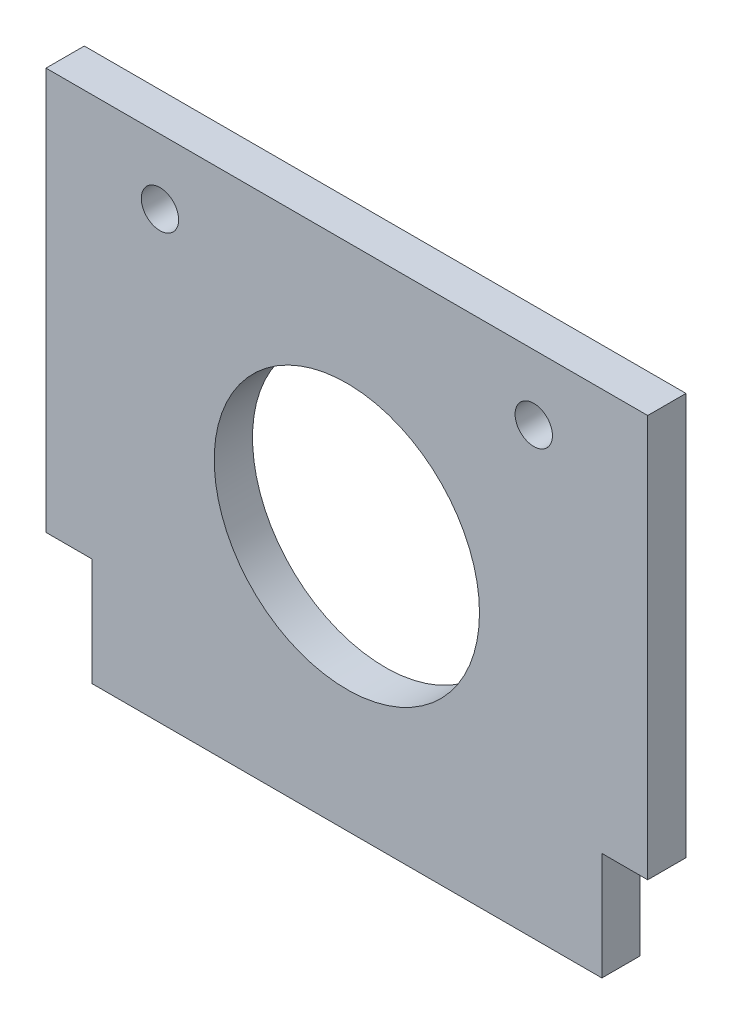
ISO-10303-21;
HEADER;
FILE_DESCRIPTION(('STEP AP214'),'2;1');
FILE_NAME('part.step','',(''),(''),'','','');
FILE_SCHEMA(('AUTOMOTIVE_DESIGN { 1 0 10303 214 1 1 1 1 }'));
ENDSEC;
DATA;
#1=APPLICATION_CONTEXT('core data for automotive mechanical design processes');
#2=APPLICATION_PROTOCOL_DEFINITION('international standard','automotive_design',2000,#1);
#3=PRODUCT_CONTEXT('',#1,'mechanical');
#4=PRODUCT('Part','Part','',(#3));
#5=PRODUCT_RELATED_PRODUCT_CATEGORY('part','',(#4));
#6=PRODUCT_DEFINITION_FORMATION('','',#4);
#7=PRODUCT_DEFINITION_CONTEXT('part definition',#1,'design');
#8=PRODUCT_DEFINITION('design','',#6,#7);
#9=PRODUCT_DEFINITION_SHAPE('','',#8);
#10=(LENGTH_UNIT() NAMED_UNIT(*) SI_UNIT(.MILLI.,.METRE.));
#11=(NAMED_UNIT(*) PLANE_ANGLE_UNIT() SI_UNIT($,.RADIAN.));
#12=(NAMED_UNIT(*) SI_UNIT($,.STERADIAN.) SOLID_ANGLE_UNIT());
#13=UNCERTAINTY_MEASURE_WITH_UNIT(LENGTH_MEASURE(1.E-05),#10,'distance_accuracy_value','');
#14=(GEOMETRIC_REPRESENTATION_CONTEXT(3) GLOBAL_UNCERTAINTY_ASSIGNED_CONTEXT((#13)) GLOBAL_UNIT_ASSIGNED_CONTEXT((#10,
#11,#12)) REPRESENTATION_CONTEXT('',''));
#15=CARTESIAN_POINT('',(0.,0.,0.));
#16=DIRECTION('',(0.,0.,1.));
#17=DIRECTION('',(1.,0.,0.));
#18=AXIS2_PLACEMENT_3D('',#15,#16,#17);
#19=CARTESIAN_POINT('',(0.,0.,3.175));
#20=DIRECTION('',(0.,0.,1.));
#21=DIRECTION('',(1.,0.,0.));
#22=AXIS2_PLACEMENT_3D('',#19,#20,#21);
#23=PLANE('',#22);
#24=CARTESIAN_POINT('',(36.65,36.9,3.175));
#25=DIRECTION('',(0.,0.,1.));
#26=DIRECTION('',(1.,0.,0.));
#27=AXIS2_PLACEMENT_3D('',#24,#25,#26);
#28=CIRCLE('',#27,1.55);
#29=CARTESIAN_POINT('',(38.2,36.9,3.175));
#30=VERTEX_POINT('',#29);
#31=EDGE_CURVE('E192',#30,#30,#28,.T.);
#32=ORIENTED_EDGE('',*,*,#31,.F.);
#33=EDGE_LOOP('',(#32));
#34=FACE_BOUND('',#33,.T.);
#35=DIRECTION('',(0.,-1.,0.));
#36=VECTOR('',#35,1.);
#37=CARTESIAN_POINT('',(0.,0.,3.175));
#38=LINE('',#37,#36);
#39=CARTESIAN_POINT('',(0.,8.95010245944664,3.175));
#40=VERTEX_POINT('',#39);
#41=CARTESIAN_POINT('',(0.,0.,3.175));
#42=VERTEX_POINT('',#41);
#43=EDGE_CURVE('E155',#40,#42,#38,.T.);
#44=ORIENTED_EDGE('',*,*,#43,.T.);
#45=DIRECTION('',(1.,0.,0.));
#46=VECTOR('',#45,1.);
#47=CARTESIAN_POINT('',(0.,0.,3.175));
#48=LINE('',#47,#46);
#49=CARTESIAN_POINT('',(42.3,0.,3.175));
#50=VERTEX_POINT('',#49);
#51=EDGE_CURVE('E103',#42,#50,#48,.T.);
#52=ORIENTED_EDGE('',*,*,#51,.T.);
#53=DIRECTION('',(0.,1.,0.));
#54=VECTOR('',#53,1.);
#55=CARTESIAN_POINT('',(42.3,0.,3.175));
#56=LINE('',#55,#54);
#57=CARTESIAN_POINT('',(42.3,8.95010245944664,3.175));
#58=VERTEX_POINT('',#57);
#59=EDGE_CURVE('E170',#50,#58,#56,.T.);
#60=ORIENTED_EDGE('',*,*,#59,.T.);
#61=DIRECTION('',(1.,0.,0.));
#62=VECTOR('',#61,1.);
#63=CARTESIAN_POINT('',(42.3,8.95010245944664,3.175));
#64=LINE('',#63,#62);
#65=CARTESIAN_POINT('',(46.1,8.95010245944664,3.175));
#66=VERTEX_POINT('',#65);
#67=EDGE_CURVE('E183',#58,#66,#64,.T.);
#68=ORIENTED_EDGE('',*,*,#67,.T.);
#69=DIRECTION('',(0.,1.,0.));
#70=VECTOR('',#69,1.);
#71=CARTESIAN_POINT('',(46.1,42.3,3.175));
#72=LINE('',#71,#70);
#73=CARTESIAN_POINT('',(46.1,42.3,3.175));
#74=VERTEX_POINT('',#73);
#75=EDGE_CURVE('E122',#66,#74,#72,.T.);
#76=ORIENTED_EDGE('',*,*,#75,.T.);
#77=DIRECTION('',(-1.,0.,0.));
#78=VECTOR('',#77,1.);
#79=CARTESIAN_POINT('',(42.3,42.3,3.175));
#80=LINE('',#79,#78);
#81=CARTESIAN_POINT('',(-3.8,42.3,3.175));
#82=VERTEX_POINT('',#81);
#83=EDGE_CURVE('E116',#74,#82,#80,.T.);
#84=ORIENTED_EDGE('',*,*,#83,.T.);
#85=DIRECTION('',(0.,-1.,0.));
#86=VECTOR('',#85,1.);
#87=CARTESIAN_POINT('',(-3.8,42.3,3.175));
#88=LINE('',#87,#86);
#89=CARTESIAN_POINT('',(-3.8,8.95010245944664,3.175));
#90=VERTEX_POINT('',#89);
#91=EDGE_CURVE('E120',#82,#90,#88,.T.);
#92=ORIENTED_EDGE('',*,*,#91,.T.);
#93=DIRECTION('',(1.,0.,0.));
#94=VECTOR('',#93,1.);
#95=CARTESIAN_POINT('',(0.,8.95010245944664,3.175));
#96=LINE('',#95,#94);
#97=EDGE_CURVE('E60',#90,#40,#96,.T.);
#98=ORIENTED_EDGE('',*,*,#97,.T.);
#99=EDGE_LOOP('',(#44,#52,#60,#68,#76,#84,#92,#98));
#100=FACE_BOUND('',#99,.T.);
#101=CARTESIAN_POINT('',(21.15,21.15,3.175));
#102=DIRECTION('',(0.,0.,1.));
#103=DIRECTION('',(1.,0.,0.));
#104=AXIS2_PLACEMENT_3D('',#101,#102,#103);
#105=CIRCLE('',#104,11.);
#106=CARTESIAN_POINT('',(32.15,21.15,3.175));
#107=VERTEX_POINT('',#106);
#108=EDGE_CURVE('E143',#107,#107,#105,.T.);
#109=ORIENTED_EDGE('',*,*,#108,.F.);
#110=EDGE_LOOP('',(#109));
#111=FACE_BOUND('',#110,.T.);
#112=CARTESIAN_POINT('',(5.65,36.9,3.175));
#113=DIRECTION('',(0.,0.,1.));
#114=DIRECTION('',(1.,0.,0.));
#115=AXIS2_PLACEMENT_3D('',#112,#113,#114);
#116=CIRCLE('',#115,1.55);
#117=CARTESIAN_POINT('',(7.2,36.9,3.175));
#118=VERTEX_POINT('',#117);
#119=EDGE_CURVE('E198',#118,#118,#116,.T.);
#120=ORIENTED_EDGE('',*,*,#119,.F.);
#121=EDGE_LOOP('',(#120));
#122=FACE_BOUND('',#121,.T.);
#123=ADVANCED_FACE('F43',(#34,#100,#111,#122),#23,.T.);
#124=CARTESIAN_POINT('',(0.,0.,0.));
#125=DIRECTION('',(0.,0.,1.));
#126=DIRECTION('',(1.,0.,0.));
#127=AXIS2_PLACEMENT_3D('',#124,#125,#126);
#128=PLANE('',#127);
#129=DIRECTION('',(0.,-1.,0.));
#130=VECTOR('',#129,1.);
#131=CARTESIAN_POINT('',(0.,0.,0.));
#132=LINE('',#131,#130);
#133=CARTESIAN_POINT('',(0.,8.95010245944664,0.));
#134=VERTEX_POINT('',#133);
#135=CARTESIAN_POINT('',(0.,0.,0.));
#136=VERTEX_POINT('',#135);
#137=EDGE_CURVE('E139',#134,#136,#132,.T.);
#138=ORIENTED_EDGE('',*,*,#137,.F.);
#139=DIRECTION('',(1.,0.,0.));
#140=VECTOR('',#139,1.);
#141=CARTESIAN_POINT('',(0.,8.95010245944664,0.));
#142=LINE('',#141,#140);
#143=CARTESIAN_POINT('',(-3.8,8.95010245944664,0.));
#144=VERTEX_POINT('',#143);
#145=EDGE_CURVE('E95',#144,#134,#142,.T.);
#146=ORIENTED_EDGE('',*,*,#145,.F.);
#147=DIRECTION('',(0.,-1.,0.));
#148=VECTOR('',#147,1.);
#149=CARTESIAN_POINT('',(-3.8,42.3,0.));
#150=LINE('',#149,#148);
#151=CARTESIAN_POINT('',(-3.8,42.3,0.));
#152=VERTEX_POINT('',#151);
#153=EDGE_CURVE('E89',#152,#144,#150,.T.);
#154=ORIENTED_EDGE('',*,*,#153,.F.);
#155=DIRECTION('',(-1.,0.,0.));
#156=VECTOR('',#155,1.);
#157=CARTESIAN_POINT('',(0.,42.3,0.));
#158=LINE('',#157,#156);
#159=CARTESIAN_POINT('',(46.1,42.3,0.));
#160=VERTEX_POINT('',#159);
#161=EDGE_CURVE('E129',#160,#152,#158,.T.);
#162=ORIENTED_EDGE('',*,*,#161,.F.);
#163=DIRECTION('',(0.,1.,0.));
#164=VECTOR('',#163,1.);
#165=CARTESIAN_POINT('',(46.1,42.3,0.));
#166=LINE('',#165,#164);
#167=CARTESIAN_POINT('',(46.1,8.95010245944664,0.));
#168=VERTEX_POINT('',#167);
#169=EDGE_CURVE('E149',#168,#160,#166,.T.);
#170=ORIENTED_EDGE('',*,*,#169,.F.);
#171=DIRECTION('',(1.,0.,0.));
#172=VECTOR('',#171,1.);
#173=CARTESIAN_POINT('',(42.3,8.95010245944664,0.));
#174=LINE('',#173,#172);
#175=CARTESIAN_POINT('',(42.3,8.95010245944664,0.));
#176=VERTEX_POINT('',#175);
#177=EDGE_CURVE('E147',#176,#168,#174,.T.);
#178=ORIENTED_EDGE('',*,*,#177,.F.);
#179=DIRECTION('',(0.,1.,0.));
#180=VECTOR('',#179,1.);
#181=CARTESIAN_POINT('',(42.3,0.,0.));
#182=LINE('',#181,#180);
#183=CARTESIAN_POINT('',(42.3,0.,0.));
#184=VERTEX_POINT('',#183);
#185=EDGE_CURVE('E145',#184,#176,#182,.T.);
#186=ORIENTED_EDGE('',*,*,#185,.F.);
#187=DIRECTION('',(1.,0.,0.));
#188=VECTOR('',#187,1.);
#189=CARTESIAN_POINT('',(0.,0.,0.));
#190=LINE('',#189,#188);
#191=EDGE_CURVE('E142',#136,#184,#190,.T.);
#192=ORIENTED_EDGE('',*,*,#191,.F.);
#193=EDGE_LOOP('',(#138,#146,#154,#162,#170,#178,#186,#192));
#194=FACE_BOUND('',#193,.T.);
#195=CARTESIAN_POINT('',(21.15,21.15,0.));
#196=DIRECTION('',(0.,0.,1.));
#197=DIRECTION('',(1.,0.,0.));
#198=AXIS2_PLACEMENT_3D('',#195,#196,#197);
#199=CIRCLE('',#198,11.);
#200=CARTESIAN_POINT('',(32.15,21.15,0.));
#201=VERTEX_POINT('',#200);
#202=EDGE_CURVE('E189',#201,#201,#199,.T.);
#203=ORIENTED_EDGE('',*,*,#202,.T.);
#204=EDGE_LOOP('',(#203));
#205=FACE_BOUND('',#204,.T.);
#206=CARTESIAN_POINT('',(36.65,36.9,0.));
#207=DIRECTION('',(0.,0.,1.));
#208=DIRECTION('',(1.,0.,0.));
#209=AXIS2_PLACEMENT_3D('',#206,#207,#208);
#210=CIRCLE('',#209,1.55);
#211=CARTESIAN_POINT('',(38.2,36.9,0.));
#212=VERTEX_POINT('',#211);
#213=EDGE_CURVE('E195',#212,#212,#210,.T.);
#214=ORIENTED_EDGE('',*,*,#213,.T.);
#215=EDGE_LOOP('',(#214));
#216=FACE_BOUND('',#215,.T.);
#217=CARTESIAN_POINT('',(5.65,36.9,0.));
#218=DIRECTION('',(0.,0.,1.));
#219=DIRECTION('',(1.,0.,0.));
#220=AXIS2_PLACEMENT_3D('',#217,#218,#219);
#221=CIRCLE('',#220,1.55);
#222=CARTESIAN_POINT('',(7.2,36.9,0.));
#223=VERTEX_POINT('',#222);
#224=EDGE_CURVE('E201',#223,#223,#221,.T.);
#225=ORIENTED_EDGE('',*,*,#224,.T.);
#226=EDGE_LOOP('',(#225));
#227=FACE_BOUND('',#226,.T.);
#228=ADVANCED_FACE('F174',(#194,#205,#216,#227),#128,.F.);
#229=CARTESIAN_POINT('',(0.,0.,3.175));
#230=DIRECTION('',(1.,0.,0.));
#231=DIRECTION('',(0.,0.,-1.));
#232=AXIS2_PLACEMENT_3D('',#229,#230,#231);
#233=PLANE('',#232);
#234=ORIENTED_EDGE('',*,*,#137,.T.);
#235=DIRECTION('',(0.,0.,-1.));
#236=VECTOR('',#235,1.);
#237=CARTESIAN_POINT('',(0.,0.,3.175));
#238=LINE('',#237,#236);
#239=EDGE_CURVE('E13',#42,#136,#238,.T.);
#240=ORIENTED_EDGE('',*,*,#239,.F.);
#241=ORIENTED_EDGE('',*,*,#43,.F.);
#242=DIRECTION('',(0.,0.,-1.));
#243=VECTOR('',#242,1.);
#244=CARTESIAN_POINT('',(0.,8.95010245944664,3.175));
#245=LINE('',#244,#243);
#246=EDGE_CURVE('E135',#40,#134,#245,.T.);
#247=ORIENTED_EDGE('',*,*,#246,.T.);
#248=EDGE_LOOP('',(#234,#240,#241,#247));
#249=FACE_BOUND('',#248,.T.);
#250=ADVANCED_FACE('F45',(#249),#233,.F.);
#251=CARTESIAN_POINT('',(0.,0.,3.175));
#252=DIRECTION('',(0.,1.,0.));
#253=DIRECTION('',(0.,0.,1.));
#254=AXIS2_PLACEMENT_3D('',#251,#252,#253);
#255=PLANE('',#254);
#256=ORIENTED_EDGE('',*,*,#191,.T.);
#257=DIRECTION('',(0.,0.,-1.));
#258=VECTOR('',#257,1.);
#259=CARTESIAN_POINT('',(42.3,0.,3.175));
#260=LINE('',#259,#258);
#261=EDGE_CURVE('E52',#50,#184,#260,.T.);
#262=ORIENTED_EDGE('',*,*,#261,.F.);
#263=ORIENTED_EDGE('',*,*,#51,.F.);
#264=ORIENTED_EDGE('',*,*,#239,.T.);
#265=EDGE_LOOP('',(#256,#262,#263,#264));
#266=FACE_BOUND('',#265,.T.);
#267=ADVANCED_FACE('F234',(#266),#255,.F.);
#268=CARTESIAN_POINT('',(42.3,0.,3.175));
#269=DIRECTION('',(-1.,0.,0.));
#270=DIRECTION('',(0.,0.,1.));
#271=AXIS2_PLACEMENT_3D('',#268,#269,#270);
#272=PLANE('',#271);
#273=ORIENTED_EDGE('',*,*,#185,.T.);
#274=DIRECTION('',(0.,0.,-1.));
#275=VECTOR('',#274,1.);
#276=CARTESIAN_POINT('',(42.3,8.95010245944664,3.175));
#277=LINE('',#276,#275);
#278=EDGE_CURVE('E162',#58,#176,#277,.T.);
#279=ORIENTED_EDGE('',*,*,#278,.F.);
#280=ORIENTED_EDGE('',*,*,#59,.F.);
#281=ORIENTED_EDGE('',*,*,#261,.T.);
#282=EDGE_LOOP('',(#273,#279,#280,#281));
#283=FACE_BOUND('',#282,.T.);
#284=ADVANCED_FACE('F168',(#283),#272,.F.);
#285=CARTESIAN_POINT('',(42.3,8.95010245944664,3.175));
#286=DIRECTION('',(0.,1.,0.));
#287=DIRECTION('',(0.,0.,1.));
#288=AXIS2_PLACEMENT_3D('',#285,#286,#287);
#289=PLANE('',#288);
#290=ORIENTED_EDGE('',*,*,#177,.T.);
#291=DIRECTION('',(0.,0.,-1.));
#292=VECTOR('',#291,1.);
#293=CARTESIAN_POINT('',(46.1,8.95010245944664,3.175));
#294=LINE('',#293,#292);
#295=EDGE_CURVE('E159',#66,#168,#294,.T.);
#296=ORIENTED_EDGE('',*,*,#295,.F.);
#297=ORIENTED_EDGE('',*,*,#67,.F.);
#298=ORIENTED_EDGE('',*,*,#278,.T.);
#299=EDGE_LOOP('',(#290,#296,#297,#298));
#300=FACE_BOUND('',#299,.T.);
#301=ADVANCED_FACE('F179',(#300),#289,.F.);
#302=CARTESIAN_POINT('',(46.1,42.3,3.175));
#303=DIRECTION('',(-1.,0.,0.));
#304=DIRECTION('',(0.,-1.,0.));
#305=AXIS2_PLACEMENT_3D('',#302,#303,#304);
#306=PLANE('',#305);
#307=ORIENTED_EDGE('',*,*,#169,.T.);
#308=DIRECTION('',(0.,0.,-1.));
#309=VECTOR('',#308,1.);
#310=CARTESIAN_POINT('',(46.1,42.3,3.175));
#311=LINE('',#310,#309);
#312=EDGE_CURVE('E130',#74,#160,#311,.T.);
#313=ORIENTED_EDGE('',*,*,#312,.F.);
#314=ORIENTED_EDGE('',*,*,#75,.F.);
#315=ORIENTED_EDGE('',*,*,#295,.T.);
#316=EDGE_LOOP('',(#307,#313,#314,#315));
#317=FACE_BOUND('',#316,.T.);
#318=ADVANCED_FACE('F182',(#317),#306,.F.);
#319=CARTESIAN_POINT('',(0.,42.3,3.175));
#320=DIRECTION('',(0.,-1.,0.));
#321=DIRECTION('',(0.,0.,-1.));
#322=AXIS2_PLACEMENT_3D('',#319,#320,#321);
#323=PLANE('',#322);
#324=ORIENTED_EDGE('',*,*,#161,.T.);
#325=DIRECTION('',(0.,0.,-1.));
#326=VECTOR('',#325,1.);
#327=CARTESIAN_POINT('',(-3.8,42.3,3.175));
#328=LINE('',#327,#326);
#329=EDGE_CURVE('E127',#82,#152,#328,.T.);
#330=ORIENTED_EDGE('',*,*,#329,.F.);
#331=ORIENTED_EDGE('',*,*,#83,.F.);
#332=ORIENTED_EDGE('',*,*,#312,.T.);
#333=EDGE_LOOP('',(#324,#330,#331,#332));
#334=FACE_BOUND('',#333,.T.);
#335=ADVANCED_FACE('F128',(#334),#323,.F.);
#336=CARTESIAN_POINT('',(-3.8,42.3,3.175));
#337=DIRECTION('',(1.,0.,0.));
#338=DIRECTION('',(0.,1.,0.));
#339=AXIS2_PLACEMENT_3D('',#336,#337,#338);
#340=PLANE('',#339);
#341=ORIENTED_EDGE('',*,*,#153,.T.);
#342=DIRECTION('',(0.,0.,-1.));
#343=VECTOR('',#342,1.);
#344=CARTESIAN_POINT('',(-3.8,8.95010245944664,3.175));
#345=LINE('',#344,#343);
#346=EDGE_CURVE('E131',#90,#144,#345,.T.);
#347=ORIENTED_EDGE('',*,*,#346,.F.);
#348=ORIENTED_EDGE('',*,*,#91,.F.);
#349=ORIENTED_EDGE('',*,*,#329,.T.);
#350=EDGE_LOOP('',(#341,#347,#348,#349));
#351=FACE_BOUND('',#350,.T.);
#352=ADVANCED_FACE('F133',(#351),#340,.F.);
#353=CARTESIAN_POINT('',(0.,8.95010245944664,3.175));
#354=DIRECTION('',(0.,1.,0.));
#355=DIRECTION('',(0.,0.,1.));
#356=AXIS2_PLACEMENT_3D('',#353,#354,#355);
#357=PLANE('',#356);
#358=ORIENTED_EDGE('',*,*,#145,.T.);
#359=ORIENTED_EDGE('',*,*,#246,.F.);
#360=ORIENTED_EDGE('',*,*,#97,.F.);
#361=ORIENTED_EDGE('',*,*,#346,.T.);
#362=EDGE_LOOP('',(#358,#359,#360,#361));
#363=FACE_BOUND('',#362,.T.);
#364=ADVANCED_FACE('F222',(#363),#357,.F.);
#365=CARTESIAN_POINT('',(21.15,21.15,3.175));
#366=DIRECTION('',(0.,0.,-1.));
#367=DIRECTION('',(-1.,0.,0.));
#368=AXIS2_PLACEMENT_3D('',#365,#366,#367);
#369=CYLINDRICAL_SURFACE('',#368,11.);
#370=ORIENTED_EDGE('',*,*,#108,.T.);
#371=EDGE_LOOP('',(#370));
#372=FACE_BOUND('',#371,.T.);
#373=ORIENTED_EDGE('',*,*,#202,.F.);
#374=EDGE_LOOP('',(#373));
#375=FACE_BOUND('',#374,.T.);
#376=ADVANCED_FACE('F219',(#372,#375),#369,.F.);
#377=CARTESIAN_POINT('',(36.65,36.9,3.175));
#378=DIRECTION('',(0.,0.,-1.));
#379=DIRECTION('',(-1.,0.,0.));
#380=AXIS2_PLACEMENT_3D('',#377,#378,#379);
#381=CYLINDRICAL_SURFACE('',#380,1.55);
#382=ORIENTED_EDGE('',*,*,#31,.T.);
#383=EDGE_LOOP('',(#382));
#384=FACE_BOUND('',#383,.T.);
#385=ORIENTED_EDGE('',*,*,#213,.F.);
#386=EDGE_LOOP('',(#385));
#387=FACE_BOUND('',#386,.T.);
#388=ADVANCED_FACE('F304',(#384,#387),#381,.F.);
#389=CARTESIAN_POINT('',(5.65,36.9,3.175));
#390=DIRECTION('',(0.,0.,-1.));
#391=DIRECTION('',(-1.,0.,0.));
#392=AXIS2_PLACEMENT_3D('',#389,#390,#391);
#393=CYLINDRICAL_SURFACE('',#392,1.55);
#394=ORIENTED_EDGE('',*,*,#119,.T.);
#395=EDGE_LOOP('',(#394));
#396=FACE_BOUND('',#395,.T.);
#397=ORIENTED_EDGE('',*,*,#224,.F.);
#398=EDGE_LOOP('',(#397));
#399=FACE_BOUND('',#398,.T.);
#400=ADVANCED_FACE('F207',(#396,#399),#393,.F.);
#401=CLOSED_SHELL('',(#123,#228,#250,#267,#284,#301,#318,#335,#352,#364,#376,#388,#400));
#402=MANIFOLD_SOLID_BREP('B2',#401);
#403=ADVANCED_BREP_SHAPE_REPRESENTATION('',(#18,#402),#14);
#404=SHAPE_DEFINITION_REPRESENTATION(#9,#403);
ENDSEC;
END-ISO-10303-21;
